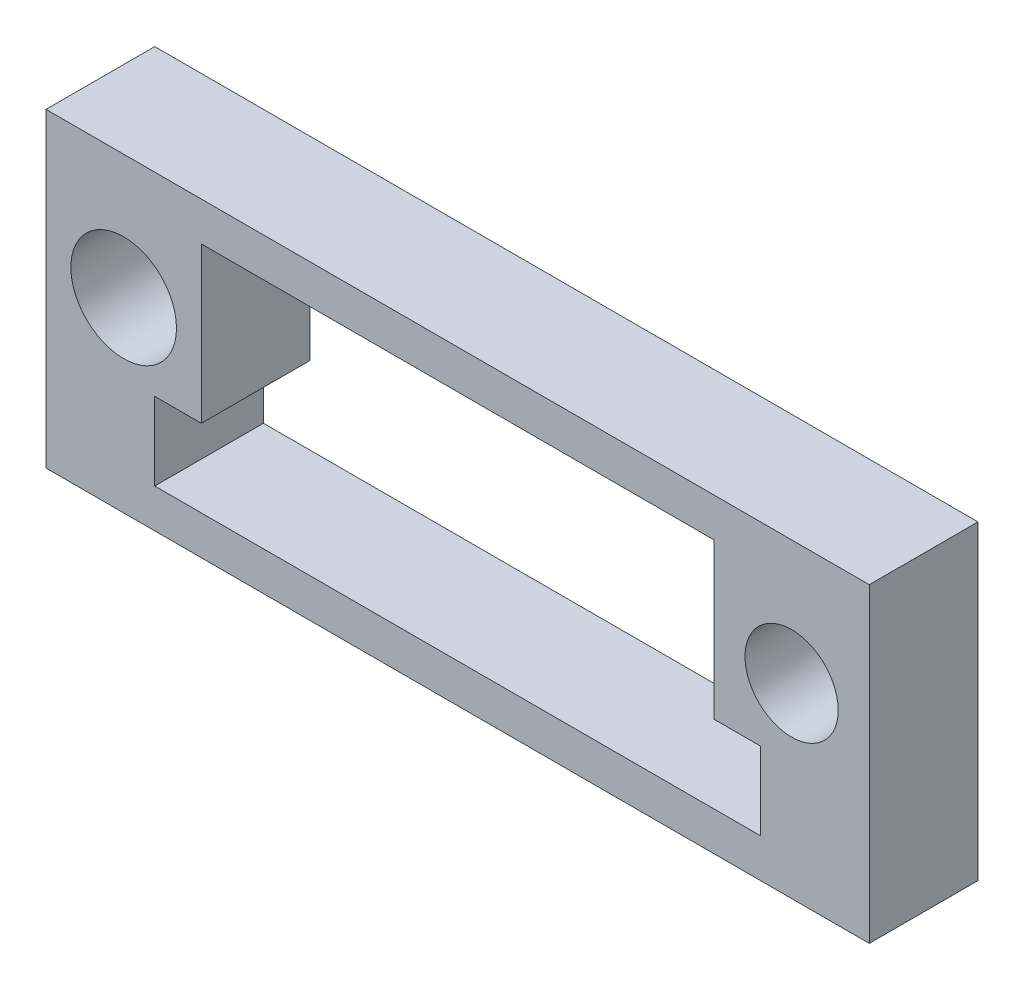
ISO-10303-21;
HEADER;
FILE_DESCRIPTION(('STEP AP214'),'2;1');
FILE_NAME('part.step','',(''),(''),'','','');
FILE_SCHEMA(('AUTOMOTIVE_DESIGN { 1 0 10303 214 1 1 1 1 }'));
ENDSEC;
DATA;
#1=APPLICATION_CONTEXT('core data for automotive mechanical design processes');
#2=APPLICATION_PROTOCOL_DEFINITION('international standard','automotive_design',2000,#1);
#3=PRODUCT_CONTEXT('',#1,'mechanical');
#4=PRODUCT('Part','Part','',(#3));
#5=PRODUCT_RELATED_PRODUCT_CATEGORY('part','',(#4));
#6=PRODUCT_DEFINITION_FORMATION('','',#4);
#7=PRODUCT_DEFINITION_CONTEXT('part definition',#1,'design');
#8=PRODUCT_DEFINITION('design','',#6,#7);
#9=PRODUCT_DEFINITION_SHAPE('','',#8);
#10=(LENGTH_UNIT() NAMED_UNIT(*) SI_UNIT(.MILLI.,.METRE.));
#11=(NAMED_UNIT(*) PLANE_ANGLE_UNIT() SI_UNIT($,.RADIAN.));
#12=(NAMED_UNIT(*) SI_UNIT($,.STERADIAN.) SOLID_ANGLE_UNIT());
#13=UNCERTAINTY_MEASURE_WITH_UNIT(LENGTH_MEASURE(1.E-05),#10,'distance_accuracy_value','');
#14=(GEOMETRIC_REPRESENTATION_CONTEXT(3) GLOBAL_UNCERTAINTY_ASSIGNED_CONTEXT((#13)) GLOBAL_UNIT_ASSIGNED_CONTEXT((#10,
#11,#12)) REPRESENTATION_CONTEXT('',''));
#15=CARTESIAN_POINT('',(0.,0.,0.));
#16=DIRECTION('',(0.,0.,1.));
#17=DIRECTION('',(1.,0.,0.));
#18=AXIS2_PLACEMENT_3D('',#15,#16,#17);
#19=CARTESIAN_POINT('',(-73.1224870406182,0.,7.));
#20=DIRECTION('',(-1.,0.,0.));
#21=DIRECTION('',(0.,0.,1.));
#22=AXIS2_PLACEMENT_3D('',#19,#20,#21);
#23=PLANE('',#22);
#24=DIRECTION('',(0.,1.,0.));
#25=VECTOR('',#24,1.);
#26=CARTESIAN_POINT('',(-73.1224870406182,0.,0.));
#27=LINE('',#26,#25);
#28=CARTESIAN_POINT('',(-73.1224870406182,-27.1287160418597,0.));
#29=VERTEX_POINT('',#28);
#30=CARTESIAN_POINT('',(-73.1224870406182,-7.1287160418597,0.));
#31=VERTEX_POINT('',#30);
#32=EDGE_CURVE('E209',#29,#31,#27,.T.);
#33=ORIENTED_EDGE('',*,*,#32,.F.);
#34=DIRECTION('',(0.,0.,-1.));
#35=VECTOR('',#34,1.);
#36=CARTESIAN_POINT('',(-73.1224870406182,-27.1287160418597,7.));
#37=LINE('',#36,#35);
#38=CARTESIAN_POINT('',(-73.1224870406182,-27.1287160418597,7.));
#39=VERTEX_POINT('',#38);
#40=EDGE_CURVE('E11',#39,#29,#37,.T.);
#41=ORIENTED_EDGE('',*,*,#40,.F.);
#42=DIRECTION('',(0.,1.,0.));
#43=VECTOR('',#42,1.);
#44=CARTESIAN_POINT('',(-73.1224870406182,0.,7.));
#45=LINE('',#44,#43);
#46=CARTESIAN_POINT('',(-73.1224870406182,-7.1287160418597,7.));
#47=VERTEX_POINT('',#46);
#48=EDGE_CURVE('E157',#39,#47,#45,.T.);
#49=ORIENTED_EDGE('',*,*,#48,.T.);
#50=DIRECTION('',(0.,0.,-1.));
#51=VECTOR('',#50,1.);
#52=CARTESIAN_POINT('',(-73.1224870406182,-7.1287160418597,7.));
#53=LINE('',#52,#51);
#54=EDGE_CURVE('E64',#47,#31,#53,.T.);
#55=ORIENTED_EDGE('',*,*,#54,.T.);
#56=EDGE_LOOP('',(#33,#41,#49,#55));
#57=FACE_BOUND('',#56,.T.);
#58=ADVANCED_FACE('F44',(#57),#23,.T.);
#59=CARTESIAN_POINT('',(0.,-27.1287160418597,7.));
#60=DIRECTION('',(0.,-1.,0.));
#61=DIRECTION('',(1.,0.,0.));
#62=AXIS2_PLACEMENT_3D('',#59,#60,#61);
#63=PLANE('',#62);
#64=DIRECTION('',(-1.,0.,0.));
#65=VECTOR('',#64,1.);
#66=CARTESIAN_POINT('',(0.,-27.1287160418597,0.));
#67=LINE('',#66,#65);
#68=CARTESIAN_POINT('',(-20.1224870406182,-27.1287160418597,0.));
#69=VERTEX_POINT('',#68);
#70=EDGE_CURVE('E145',#69,#29,#67,.T.);
#71=ORIENTED_EDGE('',*,*,#70,.F.);
#72=DIRECTION('',(0.,0.,-1.));
#73=VECTOR('',#72,1.);
#74=CARTESIAN_POINT('',(-20.1224870406182,-27.1287160418597,7.));
#75=LINE('',#74,#73);
#76=CARTESIAN_POINT('',(-20.1224870406182,-27.1287160418597,7.));
#77=VERTEX_POINT('',#76);
#78=EDGE_CURVE('E55',#77,#69,#75,.T.);
#79=ORIENTED_EDGE('',*,*,#78,.F.);
#80=DIRECTION('',(-1.,0.,0.));
#81=VECTOR('',#80,1.);
#82=CARTESIAN_POINT('',(0.,-27.1287160418597,7.));
#83=LINE('',#82,#81);
#84=EDGE_CURVE('E143',#77,#39,#83,.T.);
#85=ORIENTED_EDGE('',*,*,#84,.T.);
#86=ORIENTED_EDGE('',*,*,#40,.T.);
#87=EDGE_LOOP('',(#71,#79,#85,#86));
#88=FACE_BOUND('',#87,.T.);
#89=ADVANCED_FACE('F142',(#88),#63,.T.);
#90=CARTESIAN_POINT('',(-20.1224870406182,0.,7.));
#91=DIRECTION('',(1.,0.,0.));
#92=DIRECTION('',(0.,1.,0.));
#93=AXIS2_PLACEMENT_3D('',#90,#91,#92);
#94=PLANE('',#93);
#95=DIRECTION('',(0.,-1.,0.));
#96=VECTOR('',#95,1.);
#97=CARTESIAN_POINT('',(-20.1224870406182,0.,0.));
#98=LINE('',#97,#96);
#99=CARTESIAN_POINT('',(-20.1224870406182,-7.1287160418597,0.));
#100=VERTEX_POINT('',#99);
#101=EDGE_CURVE('E214',#100,#69,#98,.T.);
#102=ORIENTED_EDGE('',*,*,#101,.F.);
#103=DIRECTION('',(0.,0.,-1.));
#104=VECTOR('',#103,1.);
#105=CARTESIAN_POINT('',(-20.1224870406182,-7.1287160418597,7.));
#106=LINE('',#105,#104);
#107=CARTESIAN_POINT('',(-20.1224870406182,-7.1287160418597,7.));
#108=VERTEX_POINT('',#107);
#109=EDGE_CURVE('E101',#108,#100,#106,.T.);
#110=ORIENTED_EDGE('',*,*,#109,.F.);
#111=DIRECTION('',(0.,-1.,0.));
#112=VECTOR('',#111,1.);
#113=CARTESIAN_POINT('',(-20.1224870406182,0.,7.));
#114=LINE('',#113,#112);
#115=EDGE_CURVE('E156',#108,#77,#114,.T.);
#116=ORIENTED_EDGE('',*,*,#115,.T.);
#117=ORIENTED_EDGE('',*,*,#78,.T.);
#118=EDGE_LOOP('',(#102,#110,#116,#117));
#119=FACE_BOUND('',#118,.T.);
#120=ADVANCED_FACE('F160',(#119),#94,.T.);
#121=CARTESIAN_POINT('',(0.,-24.6287160418596,7.));
#122=DIRECTION('',(0.,1.,0.));
#123=DIRECTION('',(-1.,0.,0.));
#124=AXIS2_PLACEMENT_3D('',#121,#122,#123);
#125=PLANE('',#124);
#126=DIRECTION('',(1.,0.,0.));
#127=VECTOR('',#126,1.);
#128=CARTESIAN_POINT('',(0.,-24.6287160418596,0.));
#129=LINE('',#128,#127);
#130=CARTESIAN_POINT('',(-66.1224870406182,-24.6287160418597,0.));
#131=VERTEX_POINT('',#130);
#132=CARTESIAN_POINT('',(-27.1224870406182,-24.6287160418597,0.));
#133=VERTEX_POINT('',#132);
#134=EDGE_CURVE('E177',#131,#133,#129,.T.);
#135=ORIENTED_EDGE('',*,*,#134,.F.);
#136=DIRECTION('',(0.,0.,-1.));
#137=VECTOR('',#136,1.);
#138=CARTESIAN_POINT('',(-66.1224870406182,-24.6287160418597,7.));
#139=LINE('',#138,#137);
#140=CARTESIAN_POINT('',(-66.1224870406182,-24.6287160418597,7.));
#141=VERTEX_POINT('',#140);
#142=EDGE_CURVE('E48',#141,#131,#139,.T.);
#143=ORIENTED_EDGE('',*,*,#142,.F.);
#144=DIRECTION('',(1.,0.,0.));
#145=VECTOR('',#144,1.);
#146=CARTESIAN_POINT('',(0.,-24.6287160418596,7.));
#147=LINE('',#146,#145);
#148=CARTESIAN_POINT('',(-27.1224870406182,-24.6287160418597,7.));
#149=VERTEX_POINT('',#148);
#150=EDGE_CURVE('E281',#141,#149,#147,.T.);
#151=ORIENTED_EDGE('',*,*,#150,.T.);
#152=DIRECTION('',(0.,0.,-1.));
#153=VECTOR('',#152,1.);
#154=CARTESIAN_POINT('',(-27.1224870406182,-24.6287160418597,7.));
#155=LINE('',#154,#153);
#156=EDGE_CURVE('E165',#149,#133,#155,.T.);
#157=ORIENTED_EDGE('',*,*,#156,.T.);
#158=EDGE_LOOP('',(#135,#143,#151,#157));
#159=FACE_BOUND('',#158,.T.);
#160=ADVANCED_FACE('F258',(#159),#125,.T.);
#161=CARTESIAN_POINT('',(-66.1224870406182,0.,7.));
#162=DIRECTION('',(1.,0.,0.));
#163=DIRECTION('',(0.,0.,-1.));
#164=AXIS2_PLACEMENT_3D('',#161,#162,#163);
#165=PLANE('',#164);
#166=DIRECTION('',(0.,-1.,0.));
#167=VECTOR('',#166,1.);
#168=CARTESIAN_POINT('',(-66.1224870406182,0.,0.));
#169=LINE('',#168,#167);
#170=CARTESIAN_POINT('',(-66.1224870406182,-19.6287160418597,0.));
#171=VERTEX_POINT('',#170);
#172=EDGE_CURVE('E181',#171,#131,#169,.T.);
#173=ORIENTED_EDGE('',*,*,#172,.F.);
#174=DIRECTION('',(0.,0.,-1.));
#175=VECTOR('',#174,1.);
#176=CARTESIAN_POINT('',(-66.1224870406182,-19.6287160418597,7.));
#177=LINE('',#176,#175);
#178=CARTESIAN_POINT('',(-66.1224870406182,-19.6287160418597,7.));
#179=VERTEX_POINT('',#178);
#180=EDGE_CURVE('E246',#179,#171,#177,.T.);
#181=ORIENTED_EDGE('',*,*,#180,.F.);
#182=DIRECTION('',(0.,-1.,0.));
#183=VECTOR('',#182,1.);
#184=CARTESIAN_POINT('',(-66.1224870406182,0.,7.));
#185=LINE('',#184,#183);
#186=EDGE_CURVE('E257',#179,#141,#185,.T.);
#187=ORIENTED_EDGE('',*,*,#186,.T.);
#188=ORIENTED_EDGE('',*,*,#142,.T.);
#189=EDGE_LOOP('',(#173,#181,#187,#188));
#190=FACE_BOUND('',#189,.T.);
#191=ADVANCED_FACE('F255',(#190),#165,.T.);
#192=CARTESIAN_POINT('',(0.,-19.6287160418597,7.));
#193=DIRECTION('',(0.,-1.,0.));
#194=DIRECTION('',(0.,0.,-1.));
#195=AXIS2_PLACEMENT_3D('',#192,#193,#194);
#196=PLANE('',#195);
#197=DIRECTION('',(-1.,0.,0.));
#198=VECTOR('',#197,1.);
#199=CARTESIAN_POINT('',(0.,-19.6287160418597,0.));
#200=LINE('',#199,#198);
#201=CARTESIAN_POINT('',(-63.1224870406182,-19.6287160418597,0.));
#202=VERTEX_POINT('',#201);
#203=EDGE_CURVE('E185',#202,#171,#200,.T.);
#204=ORIENTED_EDGE('',*,*,#203,.F.);
#205=DIRECTION('',(0.,0.,-1.));
#206=VECTOR('',#205,1.);
#207=CARTESIAN_POINT('',(-63.1224870406182,-19.6287160418597,7.));
#208=LINE('',#207,#206);
#209=CARTESIAN_POINT('',(-63.1224870406182,-19.6287160418597,7.));
#210=VERTEX_POINT('',#209);
#211=EDGE_CURVE('E244',#210,#202,#208,.T.);
#212=ORIENTED_EDGE('',*,*,#211,.F.);
#213=DIRECTION('',(-1.,0.,0.));
#214=VECTOR('',#213,1.);
#215=CARTESIAN_POINT('',(0.,-19.6287160418597,7.));
#216=LINE('',#215,#214);
#217=EDGE_CURVE('E267',#210,#179,#216,.T.);
#218=ORIENTED_EDGE('',*,*,#217,.T.);
#219=ORIENTED_EDGE('',*,*,#180,.T.);
#220=EDGE_LOOP('',(#204,#212,#218,#219));
#221=FACE_BOUND('',#220,.T.);
#222=ADVANCED_FACE('F264',(#221),#196,.T.);
#223=CARTESIAN_POINT('',(-63.1224870406182,0.,7.));
#224=DIRECTION('',(-1.,0.,0.));
#225=DIRECTION('',(0.,0.,1.));
#226=AXIS2_PLACEMENT_3D('',#223,#224,#225);
#227=PLANE('',#226);
#228=DIRECTION('',(0.,1.,0.));
#229=VECTOR('',#228,1.);
#230=CARTESIAN_POINT('',(-63.1224870406182,0.,0.));
#231=LINE('',#230,#229);
#232=CARTESIAN_POINT('',(-63.1224870406182,-9.62871604185969,0.));
#233=VERTEX_POINT('',#232);
#234=EDGE_CURVE('E189',#202,#233,#231,.T.);
#235=ORIENTED_EDGE('',*,*,#234,.T.);
#236=DIRECTION('',(0.,0.,-1.));
#237=VECTOR('',#236,1.);
#238=CARTESIAN_POINT('',(-63.1224870406182,-9.62871604185969,7.));
#239=LINE('',#238,#237);
#240=CARTESIAN_POINT('',(-63.1224870406182,-9.62871604185969,7.));
#241=VERTEX_POINT('',#240);
#242=EDGE_CURVE('E240',#241,#233,#239,.T.);
#243=ORIENTED_EDGE('',*,*,#242,.F.);
#244=DIRECTION('',(0.,1.,0.));
#245=VECTOR('',#244,1.);
#246=CARTESIAN_POINT('',(-63.1224870406182,0.,7.));
#247=LINE('',#246,#245);
#248=EDGE_CURVE('E271',#210,#241,#247,.T.);
#249=ORIENTED_EDGE('',*,*,#248,.F.);
#250=ORIENTED_EDGE('',*,*,#211,.T.);
#251=EDGE_LOOP('',(#235,#243,#249,#250));
#252=FACE_BOUND('',#251,.T.);
#253=ADVANCED_FACE('F272',(#252),#227,.F.);
#254=CARTESIAN_POINT('',(0.,-9.62871604185969,7.));
#255=DIRECTION('',(0.,1.,0.));
#256=DIRECTION('',(0.,0.,1.));
#257=AXIS2_PLACEMENT_3D('',#254,#255,#256);
#258=PLANE('',#257);
#259=DIRECTION('',(1.,0.,0.));
#260=VECTOR('',#259,1.);
#261=CARTESIAN_POINT('',(0.,-9.62871604185969,0.));
#262=LINE('',#261,#260);
#263=CARTESIAN_POINT('',(-30.1224870406182,-9.62871604185969,0.));
#264=VERTEX_POINT('',#263);
#265=EDGE_CURVE('E193',#233,#264,#262,.T.);
#266=ORIENTED_EDGE('',*,*,#265,.T.);
#267=DIRECTION('',(0.,0.,-1.));
#268=VECTOR('',#267,1.);
#269=CARTESIAN_POINT('',(-30.1224870406182,-9.62871604185969,7.));
#270=LINE('',#269,#268);
#271=CARTESIAN_POINT('',(-30.1224870406182,-9.62871604185969,7.));
#272=VERTEX_POINT('',#271);
#273=EDGE_CURVE('E236',#272,#264,#270,.T.);
#274=ORIENTED_EDGE('',*,*,#273,.F.);
#275=DIRECTION('',(1.,0.,0.));
#276=VECTOR('',#275,1.);
#277=CARTESIAN_POINT('',(0.,-9.62871604185969,7.));
#278=LINE('',#277,#276);
#279=EDGE_CURVE('E276',#241,#272,#278,.T.);
#280=ORIENTED_EDGE('',*,*,#279,.F.);
#281=ORIENTED_EDGE('',*,*,#242,.T.);
#282=EDGE_LOOP('',(#266,#274,#280,#281));
#283=FACE_BOUND('',#282,.T.);
#284=ADVANCED_FACE('F329',(#283),#258,.F.);
#285=CARTESIAN_POINT('',(-30.1224870406182,0.,7.));
#286=DIRECTION('',(1.,0.,0.));
#287=DIRECTION('',(0.,0.,-1.));
#288=AXIS2_PLACEMENT_3D('',#285,#286,#287);
#289=PLANE('',#288);
#290=DIRECTION('',(0.,-1.,0.));
#291=VECTOR('',#290,1.);
#292=CARTESIAN_POINT('',(-30.1224870406182,0.,0.));
#293=LINE('',#292,#291);
#294=CARTESIAN_POINT('',(-30.1224870406182,-19.6287160418597,0.));
#295=VERTEX_POINT('',#294);
#296=EDGE_CURVE('E197',#264,#295,#293,.T.);
#297=ORIENTED_EDGE('',*,*,#296,.T.);
#298=DIRECTION('',(0.,0.,-1.));
#299=VECTOR('',#298,1.);
#300=CARTESIAN_POINT('',(-30.1224870406182,-19.6287160418597,7.));
#301=LINE('',#300,#299);
#302=CARTESIAN_POINT('',(-30.1224870406182,-19.6287160418597,7.));
#303=VERTEX_POINT('',#302);
#304=EDGE_CURVE('E232',#303,#295,#301,.T.);
#305=ORIENTED_EDGE('',*,*,#304,.F.);
#306=DIRECTION('',(0.,-1.,0.));
#307=VECTOR('',#306,1.);
#308=CARTESIAN_POINT('',(-30.1224870406182,0.,7.));
#309=LINE('',#308,#307);
#310=EDGE_CURVE('E287',#272,#303,#309,.T.);
#311=ORIENTED_EDGE('',*,*,#310,.F.);
#312=ORIENTED_EDGE('',*,*,#273,.T.);
#313=EDGE_LOOP('',(#297,#305,#311,#312));
#314=FACE_BOUND('',#313,.T.);
#315=ADVANCED_FACE('F325',(#314),#289,.F.);
#316=CARTESIAN_POINT('',(0.,-19.6287160418597,7.));
#317=DIRECTION('',(0.,1.,0.));
#318=DIRECTION('',(0.,0.,1.));
#319=AXIS2_PLACEMENT_3D('',#316,#317,#318);
#320=PLANE('',#319);
#321=DIRECTION('',(1.,0.,0.));
#322=VECTOR('',#321,1.);
#323=CARTESIAN_POINT('',(0.,-19.6287160418597,0.));
#324=LINE('',#323,#322);
#325=CARTESIAN_POINT('',(-27.1224870406182,-19.6287160418597,0.));
#326=VERTEX_POINT('',#325);
#327=EDGE_CURVE('E201',#295,#326,#324,.T.);
#328=ORIENTED_EDGE('',*,*,#327,.T.);
#329=DIRECTION('',(0.,0.,-1.));
#330=VECTOR('',#329,1.);
#331=CARTESIAN_POINT('',(-27.1224870406182,-19.6287160418597,7.));
#332=LINE('',#331,#330);
#333=CARTESIAN_POINT('',(-27.1224870406182,-19.6287160418597,7.));
#334=VERTEX_POINT('',#333);
#335=EDGE_CURVE('E228',#334,#326,#332,.T.);
#336=ORIENTED_EDGE('',*,*,#335,.F.);
#337=DIRECTION('',(1.,0.,0.));
#338=VECTOR('',#337,1.);
#339=CARTESIAN_POINT('',(0.,-19.6287160418597,7.));
#340=LINE('',#339,#338);
#341=EDGE_CURVE('E291',#303,#334,#340,.T.);
#342=ORIENTED_EDGE('',*,*,#341,.F.);
#343=ORIENTED_EDGE('',*,*,#304,.T.);
#344=EDGE_LOOP('',(#328,#336,#342,#343));
#345=FACE_BOUND('',#344,.T.);
#346=ADVANCED_FACE('F321',(#345),#320,.F.);
#347=CARTESIAN_POINT('',(-27.1224870406182,0.,7.));
#348=DIRECTION('',(1.,0.,0.));
#349=DIRECTION('',(0.,1.,0.));
#350=AXIS2_PLACEMENT_3D('',#347,#348,#349);
#351=PLANE('',#350);
#352=DIRECTION('',(0.,-1.,0.));
#353=VECTOR('',#352,1.);
#354=CARTESIAN_POINT('',(-27.1224870406182,0.,0.));
#355=LINE('',#354,#353);
#356=EDGE_CURVE('E205',#326,#133,#355,.T.);
#357=ORIENTED_EDGE('',*,*,#356,.T.);
#358=ORIENTED_EDGE('',*,*,#156,.F.);
#359=DIRECTION('',(0.,-1.,0.));
#360=VECTOR('',#359,1.);
#361=CARTESIAN_POINT('',(-27.1224870406182,0.,7.));
#362=LINE('',#361,#360);
#363=EDGE_CURVE('E295',#334,#149,#362,.T.);
#364=ORIENTED_EDGE('',*,*,#363,.F.);
#365=ORIENTED_EDGE('',*,*,#335,.T.);
#366=EDGE_LOOP('',(#357,#358,#364,#365));
#367=FACE_BOUND('',#366,.T.);
#368=ADVANCED_FACE('F318',(#367),#351,.F.);
#369=CARTESIAN_POINT('',(-68.1224870406182,-15.1287160418597,7.));
#370=DIRECTION('',(0.,0.,-1.));
#371=DIRECTION('',(-1.,0.,0.));
#372=AXIS2_PLACEMENT_3D('',#369,#370,#371);
#373=CYLINDRICAL_SURFACE('',#372,3.4);
#374=CARTESIAN_POINT('',(-68.1224870406182,-15.1287160418597,7.));
#375=DIRECTION('',(0.,0.,1.));
#376=DIRECTION('',(1.,0.,0.));
#377=AXIS2_PLACEMENT_3D('',#374,#375,#376);
#378=CIRCLE('',#377,3.4);
#379=CARTESIAN_POINT('',(-64.7224870406182,-15.1287160418597,7.));
#380=VERTEX_POINT('',#379);
#381=EDGE_CURVE('E348',#380,#380,#378,.T.);
#382=ORIENTED_EDGE('',*,*,#381,.T.);
#383=EDGE_LOOP('',(#382));
#384=FACE_BOUND('',#383,.T.);
#385=CARTESIAN_POINT('',(-68.1224870406182,-15.1287160418597,0.));
#386=DIRECTION('',(0.,0.,1.));
#387=DIRECTION('',(1.,0.,0.));
#388=AXIS2_PLACEMENT_3D('',#385,#386,#387);
#389=CIRCLE('',#388,3.4);
#390=CARTESIAN_POINT('',(-64.7224870406182,-15.1287160418597,0.));
#391=VERTEX_POINT('',#390);
#392=EDGE_CURVE('E173',#391,#391,#389,.T.);
#393=ORIENTED_EDGE('',*,*,#392,.F.);
#394=EDGE_LOOP('',(#393));
#395=FACE_BOUND('',#394,.T.);
#396=ADVANCED_FACE('F307',(#384,#395),#373,.F.);
#397=CARTESIAN_POINT('',(-25.1224870406182,-15.1287160418597,7.));
#398=DIRECTION('',(0.,0.,-1.));
#399=DIRECTION('',(-1.,0.,0.));
#400=AXIS2_PLACEMENT_3D('',#397,#398,#399);
#401=CYLINDRICAL_SURFACE('',#400,3.);
#402=CARTESIAN_POINT('',(-25.1224870406182,-15.1287160418597,7.));
#403=DIRECTION('',(0.,0.,1.));
#404=DIRECTION('',(1.,0.,0.));
#405=AXIS2_PLACEMENT_3D('',#402,#403,#404);
#406=CIRCLE('',#405,3.);
#407=CARTESIAN_POINT('',(-22.1224870406182,-15.1287160418597,7.));
#408=VERTEX_POINT('',#407);
#409=EDGE_CURVE('E221',#408,#408,#406,.T.);
#410=ORIENTED_EDGE('',*,*,#409,.T.);
#411=EDGE_LOOP('',(#410));
#412=FACE_BOUND('',#411,.T.);
#413=CARTESIAN_POINT('',(-25.1224870406182,-15.1287160418597,0.));
#414=DIRECTION('',(0.,0.,1.));
#415=DIRECTION('',(1.,0.,0.));
#416=AXIS2_PLACEMENT_3D('',#413,#414,#415);
#417=CIRCLE('',#416,3.);
#418=CARTESIAN_POINT('',(-22.1224870406182,-15.1287160418597,0.));
#419=VERTEX_POINT('',#418);
#420=EDGE_CURVE('E169',#419,#419,#417,.T.);
#421=ORIENTED_EDGE('',*,*,#420,.F.);
#422=EDGE_LOOP('',(#421));
#423=FACE_BOUND('',#422,.T.);
#424=ADVANCED_FACE('F46',(#412,#423),#401,.F.);
#425=CARTESIAN_POINT('',(0.,-7.1287160418597,7.));
#426=DIRECTION('',(0.,1.,0.));
#427=DIRECTION('',(0.,0.,1.));
#428=AXIS2_PLACEMENT_3D('',#425,#426,#427);
#429=PLANE('',#428);
#430=DIRECTION('',(1.,0.,0.));
#431=VECTOR('',#430,1.);
#432=CARTESIAN_POINT('',(0.,-7.1287160418597,0.));
#433=LINE('',#432,#431);
#434=EDGE_CURVE('E217',#31,#100,#433,.T.);
#435=ORIENTED_EDGE('',*,*,#434,.F.);
#436=ORIENTED_EDGE('',*,*,#54,.F.);
#437=DIRECTION('',(1.,0.,0.));
#438=VECTOR('',#437,1.);
#439=CARTESIAN_POINT('',(0.,-7.1287160418597,7.));
#440=LINE('',#439,#438);
#441=EDGE_CURVE('E162',#47,#108,#440,.T.);
#442=ORIENTED_EDGE('',*,*,#441,.T.);
#443=ORIENTED_EDGE('',*,*,#109,.T.);
#444=EDGE_LOOP('',(#435,#436,#442,#443));
#445=FACE_BOUND('',#444,.T.);
#446=ADVANCED_FACE('F298',(#445),#429,.T.);
#447=CARTESIAN_POINT('',(0.,0.,7.));
#448=DIRECTION('',(0.,0.,1.));
#449=DIRECTION('',(1.,0.,0.));
#450=AXIS2_PLACEMENT_3D('',#447,#448,#449);
#451=PLANE('',#450);
#452=ORIENTED_EDGE('',*,*,#409,.F.);
#453=EDGE_LOOP('',(#452));
#454=FACE_BOUND('',#453,.T.);
#455=ORIENTED_EDGE('',*,*,#381,.F.);
#456=EDGE_LOOP('',(#455));
#457=FACE_BOUND('',#456,.T.);
#458=ORIENTED_EDGE('',*,*,#150,.F.);
#459=ORIENTED_EDGE('',*,*,#186,.F.);
#460=ORIENTED_EDGE('',*,*,#217,.F.);
#461=ORIENTED_EDGE('',*,*,#248,.T.);
#462=ORIENTED_EDGE('',*,*,#279,.T.);
#463=ORIENTED_EDGE('',*,*,#310,.T.);
#464=ORIENTED_EDGE('',*,*,#341,.T.);
#465=ORIENTED_EDGE('',*,*,#363,.T.);
#466=EDGE_LOOP('',(#458,#459,#460,#461,#462,#463,#464,#465));
#467=FACE_BOUND('',#466,.T.);
#468=ORIENTED_EDGE('',*,*,#48,.F.);
#469=ORIENTED_EDGE('',*,*,#84,.F.);
#470=ORIENTED_EDGE('',*,*,#115,.F.);
#471=ORIENTED_EDGE('',*,*,#441,.F.);
#472=EDGE_LOOP('',(#468,#469,#470,#471));
#473=FACE_BOUND('',#472,.T.);
#474=ADVANCED_FACE('F154',(#454,#457,#467,#473),#451,.T.);
#475=CARTESIAN_POINT('',(0.,0.,0.));
#476=DIRECTION('',(0.,0.,1.));
#477=DIRECTION('',(1.,0.,0.));
#478=AXIS2_PLACEMENT_3D('',#475,#476,#477);
#479=PLANE('',#478);
#480=ORIENTED_EDGE('',*,*,#420,.T.);
#481=EDGE_LOOP('',(#480));
#482=FACE_BOUND('',#481,.T.);
#483=ORIENTED_EDGE('',*,*,#392,.T.);
#484=EDGE_LOOP('',(#483));
#485=FACE_BOUND('',#484,.T.);
#486=ORIENTED_EDGE('',*,*,#134,.T.);
#487=ORIENTED_EDGE('',*,*,#356,.F.);
#488=ORIENTED_EDGE('',*,*,#327,.F.);
#489=ORIENTED_EDGE('',*,*,#296,.F.);
#490=ORIENTED_EDGE('',*,*,#265,.F.);
#491=ORIENTED_EDGE('',*,*,#234,.F.);
#492=ORIENTED_EDGE('',*,*,#203,.T.);
#493=ORIENTED_EDGE('',*,*,#172,.T.);
#494=EDGE_LOOP('',(#486,#487,#488,#489,#490,#491,#492,#493));
#495=FACE_BOUND('',#494,.T.);
#496=ORIENTED_EDGE('',*,*,#32,.T.);
#497=ORIENTED_EDGE('',*,*,#434,.T.);
#498=ORIENTED_EDGE('',*,*,#101,.T.);
#499=ORIENTED_EDGE('',*,*,#70,.T.);
#500=EDGE_LOOP('',(#496,#497,#498,#499));
#501=FACE_BOUND('',#500,.T.);
#502=ADVANCED_FACE('F261',(#482,#485,#495,#501),#479,.F.);
#503=CLOSED_SHELL('',(#58,#89,#120,#160,#191,#222,#253,#284,#315,#346,#368,#396,#424,#446,#474,#502));
#504=MANIFOLD_SOLID_BREP('B2',#503);
#505=ADVANCED_BREP_SHAPE_REPRESENTATION('',(#18,#504),#14);
#506=SHAPE_DEFINITION_REPRESENTATION(#9,#505);
ENDSEC;
END-ISO-10303-21;
